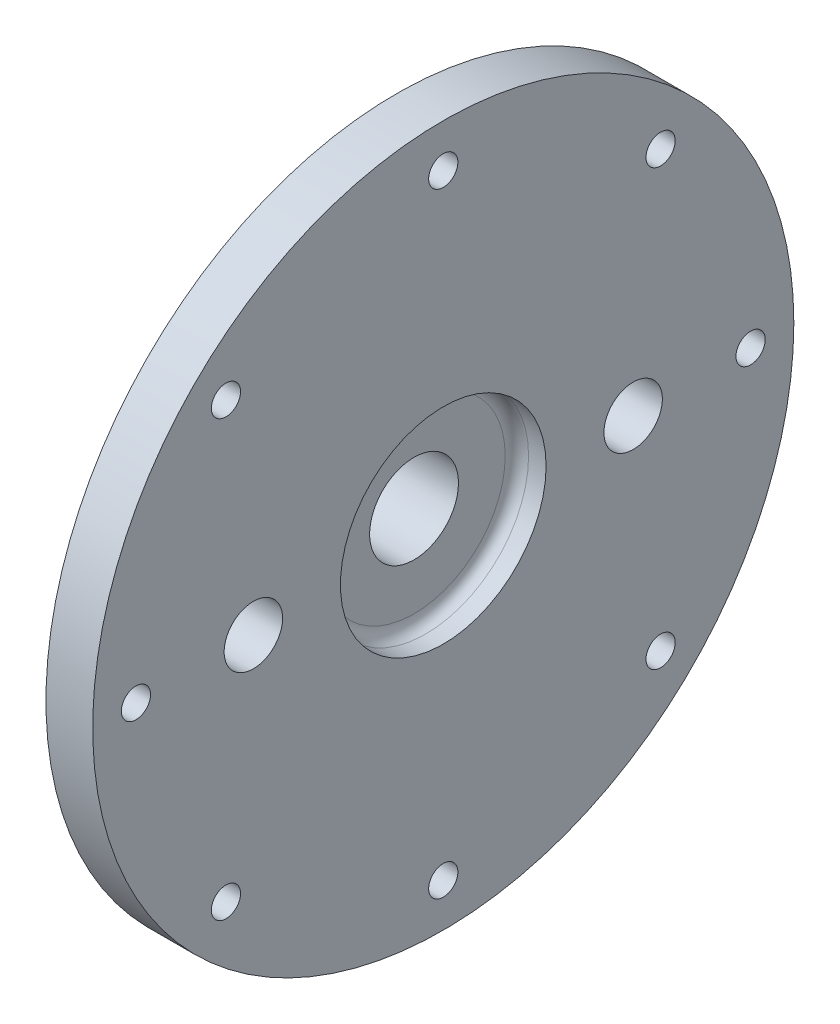
ISO-10303-21;
HEADER;
FILE_DESCRIPTION(('STEP AP214'),'2;1');
FILE_NAME('part.step','',(''),(''),'','','');
FILE_SCHEMA(('AUTOMOTIVE_DESIGN { 1 0 10303 214 1 1 1 1 }'));
ENDSEC;
DATA;
#1=APPLICATION_CONTEXT('core data for automotive mechanical design processes');
#2=APPLICATION_PROTOCOL_DEFINITION('international standard','automotive_design',2000,#1);
#3=PRODUCT_CONTEXT('',#1,'mechanical');
#4=PRODUCT('Part','Part','',(#3));
#5=PRODUCT_RELATED_PRODUCT_CATEGORY('part','',(#4));
#6=PRODUCT_DEFINITION_FORMATION('','',#4);
#7=PRODUCT_DEFINITION_CONTEXT('part definition',#1,'design');
#8=PRODUCT_DEFINITION('design','',#6,#7);
#9=PRODUCT_DEFINITION_SHAPE('','',#8);
#10=(LENGTH_UNIT() NAMED_UNIT(*) SI_UNIT(.MILLI.,.METRE.));
#11=(NAMED_UNIT(*) PLANE_ANGLE_UNIT() SI_UNIT($,.RADIAN.));
#12=(NAMED_UNIT(*) SI_UNIT($,.STERADIAN.) SOLID_ANGLE_UNIT());
#13=UNCERTAINTY_MEASURE_WITH_UNIT(LENGTH_MEASURE(1.E-05),#10,'distance_accuracy_value','');
#14=(GEOMETRIC_REPRESENTATION_CONTEXT(3) GLOBAL_UNCERTAINTY_ASSIGNED_CONTEXT((#13)) GLOBAL_UNIT_ASSIGNED_CONTEXT((#10,
#11,#12)) REPRESENTATION_CONTEXT('',''));
#15=CARTESIAN_POINT('',(0.,0.,0.));
#16=DIRECTION('',(0.,0.,1.));
#17=DIRECTION('',(1.,0.,0.));
#18=AXIS2_PLACEMENT_3D('',#15,#16,#17);
#19=CARTESIAN_POINT('',(0.,22.352,0.));
#20=DIRECTION('',(1.,0.,0.));
#21=DIRECTION('',(0.,0.,-1.));
#22=AXIS2_PLACEMENT_3D('',#19,#20,#21);
#23=PLANE('',#22);
#24=CARTESIAN_POINT('',(0.,66.802,2.33237936397399E-13));
#25=DIRECTION('',(1.,0.,0.));
#26=DIRECTION('',(0.,1.,0.));
#27=AXIS2_PLACEMENT_3D('',#24,#25,#26);
#28=CIRCLE('',#27,3.175);
#29=CARTESIAN_POINT('',(0.,69.977,2.44323389648226E-13));
#30=VERTEX_POINT('',#29);
#31=EDGE_CURVE('E165',#30,#30,#28,.T.);
#32=ORIENTED_EDGE('',*,*,#31,.F.);
#33=EDGE_LOOP('',(#32));
#34=FACE_BOUND('',#33,.T.);
#35=CARTESIAN_POINT('',(0.,47.2361471968235,47.236147196824));
#36=DIRECTION('',(1.,0.,0.));
#37=DIRECTION('',(0.,0.707106781186544,0.707106781186551));
#38=AXIS2_PLACEMENT_3D('',#35,#36,#37);
#39=CIRCLE('',#38,3.175);
#40=CARTESIAN_POINT('',(0.,49.4812112270908,49.4812112270913));
#41=VERTEX_POINT('',#40);
#42=EDGE_CURVE('E169',#41,#41,#39,.T.);
#43=ORIENTED_EDGE('',*,*,#42,.F.);
#44=EDGE_LOOP('',(#43));
#45=FACE_BOUND('',#44,.T.);
#46=CARTESIAN_POINT('',(0.,0.,66.802));
#47=DIRECTION('',(1.,0.,0.));
#48=DIRECTION('',(0.,0.,1.));
#49=AXIS2_PLACEMENT_3D('',#46,#47,#48);
#50=CIRCLE('',#49,3.175);
#51=CARTESIAN_POINT('',(0.,0.,69.977));
#52=VERTEX_POINT('',#51);
#53=EDGE_CURVE('E173',#52,#52,#50,.T.);
#54=ORIENTED_EDGE('',*,*,#53,.F.);
#55=EDGE_LOOP('',(#54));
#56=FACE_BOUND('',#55,.T.);
#57=CARTESIAN_POINT('',(0.,-47.2361471968242,47.2361471968233));
#58=DIRECTION('',(1.,0.,0.));
#59=DIRECTION('',(0.,-0.707106781186554,0.707106781186541));
#60=AXIS2_PLACEMENT_3D('',#57,#58,#59);
#61=CIRCLE('',#60,3.175);
#62=CARTESIAN_POINT('',(0.,-49.4812112270915,49.4812112270906));
#63=VERTEX_POINT('',#62);
#64=EDGE_CURVE('E177',#63,#63,#61,.T.);
#65=ORIENTED_EDGE('',*,*,#64,.F.);
#66=EDGE_LOOP('',(#65));
#67=FACE_BOUND('',#66,.T.);
#68=CARTESIAN_POINT('',(0.,-66.802,-6.99713809192197E-13));
#69=DIRECTION('',(1.,0.,0.));
#70=DIRECTION('',(0.,-1.,0.));
#71=AXIS2_PLACEMENT_3D('',#68,#69,#70);
#72=CIRCLE('',#71,3.175);
#73=CARTESIAN_POINT('',(0.,-69.977,-7.32970168944678E-13));
#74=VERTEX_POINT('',#73);
#75=EDGE_CURVE('E181',#74,#74,#72,.T.);
#76=ORIENTED_EDGE('',*,*,#75,.F.);
#77=EDGE_LOOP('',(#76));
#78=FACE_BOUND('',#77,.T.);
#79=CARTESIAN_POINT('',(0.,-47.2361471968232,-47.2361471968243));
#80=DIRECTION('',(1.,0.,0.));
#81=DIRECTION('',(0.,-0.707106781186539,-0.707106781186556));
#82=AXIS2_PLACEMENT_3D('',#79,#80,#81);
#83=CIRCLE('',#82,3.175);
#84=CARTESIAN_POINT('',(0.,-49.4812112270904,-49.4812112270916));
#85=VERTEX_POINT('',#84);
#86=EDGE_CURVE('E185',#85,#85,#83,.T.);
#87=ORIENTED_EDGE('',*,*,#86,.F.);
#88=EDGE_LOOP('',(#87));
#89=FACE_BOUND('',#88,.T.);
#90=CARTESIAN_POINT('',(0.,47.2361471968238,-47.2361471968237));
#91=DIRECTION('',(1.,0.,0.));
#92=DIRECTION('',(0.,0.707106781186549,-0.707106781186546));
#93=AXIS2_PLACEMENT_3D('',#90,#91,#92);
#94=CIRCLE('',#93,3.175);
#95=CARTESIAN_POINT('',(0.,49.4812112270911,-49.481211227091));
#96=VERTEX_POINT('',#95);
#97=EDGE_CURVE('E75',#96,#96,#94,.T.);
#98=ORIENTED_EDGE('',*,*,#97,.F.);
#99=EDGE_LOOP('',(#98));
#100=FACE_BOUND('',#99,.T.);
#101=CARTESIAN_POINT('',(0.,0.,-66.802));
#102=DIRECTION('',(1.,0.,0.));
#103=DIRECTION('',(0.,0.,-1.));
#104=AXIS2_PLACEMENT_3D('',#101,#102,#103);
#105=CIRCLE('',#104,3.175);
#106=CARTESIAN_POINT('',(0.,0.,-69.977));
#107=VERTEX_POINT('',#106);
#108=EDGE_CURVE('E69',#107,#107,#105,.T.);
#109=ORIENTED_EDGE('',*,*,#108,.F.);
#110=EDGE_LOOP('',(#109));
#111=FACE_BOUND('',#110,.T.);
#112=CARTESIAN_POINT('',(0.,0.,-41.275));
#113=DIRECTION('',(1.,0.,0.));
#114=DIRECTION('',(0.,0.,-1.));
#115=AXIS2_PLACEMENT_3D('',#112,#113,#114);
#116=CIRCLE('',#115,6.35);
#117=CARTESIAN_POINT('',(0.,0.,-47.625));
#118=VERTEX_POINT('',#117);
#119=EDGE_CURVE('E65',#118,#118,#116,.T.);
#120=ORIENTED_EDGE('',*,*,#119,.F.);
#121=EDGE_LOOP('',(#120));
#122=FACE_BOUND('',#121,.T.);
#123=CARTESIAN_POINT('',(0.,0.,41.275));
#124=DIRECTION('',(1.,0.,0.));
#125=DIRECTION('',(0.,0.,-1.));
#126=AXIS2_PLACEMENT_3D('',#123,#124,#125);
#127=CIRCLE('',#126,6.35);
#128=CARTESIAN_POINT('',(0.,0.,34.925));
#129=VERTEX_POINT('',#128);
#130=EDGE_CURVE('E59',#129,#129,#127,.T.);
#131=ORIENTED_EDGE('',*,*,#130,.F.);
#132=EDGE_LOOP('',(#131));
#133=FACE_BOUND('',#132,.T.);
#134=CARTESIAN_POINT('',(0.,0.,0.));
#135=DIRECTION('',(1.,0.,0.));
#136=DIRECTION('',(0.,0.,-1.));
#137=AXIS2_PLACEMENT_3D('',#134,#135,#136);
#138=CIRCLE('',#137,76.2);
#139=CARTESIAN_POINT('',(0.,0.,-76.2));
#140=VERTEX_POINT('',#139);
#141=EDGE_CURVE('E113',#140,#140,#138,.T.);
#142=ORIENTED_EDGE('',*,*,#141,.T.);
#143=EDGE_LOOP('',(#142));
#144=FACE_BOUND('',#143,.T.);
#145=CARTESIAN_POINT('',(0.,0.,0.));
#146=DIRECTION('',(1.,0.,0.));
#147=DIRECTION('',(0.,0.,-1.));
#148=AXIS2_PLACEMENT_3D('',#145,#146,#147);
#149=CIRCLE('',#148,22.352);
#150=CARTESIAN_POINT('',(0.,0.,-22.352));
#151=VERTEX_POINT('',#150);
#152=EDGE_CURVE('E10',#151,#151,#149,.T.);
#153=ORIENTED_EDGE('',*,*,#152,.F.);
#154=EDGE_LOOP('',(#153));
#155=FACE_BOUND('',#154,.T.);
#156=ADVANCED_FACE('F37',(#34,#45,#56,#67,#78,#89,#100,#111,#122,#133,#144,#155),#23,.T.);
#157=CARTESIAN_POINT('',(0.,0.,0.));
#158=DIRECTION('',(1.,0.,0.));
#159=DIRECTION('',(0.,0.,-1.));
#160=AXIS2_PLACEMENT_3D('',#157,#158,#159);
#161=CYLINDRICAL_SURFACE('',#160,22.352);
#162=ORIENTED_EDGE('',*,*,#152,.T.);
#163=EDGE_LOOP('',(#162));
#164=FACE_BOUND('',#163,.T.);
#165=CARTESIAN_POINT('',(-3.81,0.,0.));
#166=DIRECTION('',(1.,0.,0.));
#167=DIRECTION('',(0.,0.,-1.));
#168=AXIS2_PLACEMENT_3D('',#165,#166,#167);
#169=CIRCLE('',#168,22.352);
#170=CARTESIAN_POINT('',(-3.81,0.,-22.352));
#171=VERTEX_POINT('',#170);
#172=EDGE_CURVE('E45',#171,#171,#169,.T.);
#173=ORIENTED_EDGE('',*,*,#172,.F.);
#174=EDGE_LOOP('',(#173));
#175=FACE_BOUND('',#174,.T.);
#176=ADVANCED_FACE('F149',(#164,#175),#161,.F.);
#177=CARTESIAN_POINT('',(-3.81,0.,0.));
#178=DIRECTION('',(1.,0.,0.));
#179=DIRECTION('',(0.,0.,-1.));
#180=AXIS2_PLACEMENT_3D('',#177,#178,#179);
#181=TOROIDAL_SURFACE('',#180,19.812,2.54);
#182=ORIENTED_EDGE('',*,*,#172,.T.);
#183=EDGE_LOOP('',(#182));
#184=FACE_BOUND('',#183,.T.);
#185=CARTESIAN_POINT('',(-6.35,0.,0.));
#186=DIRECTION('',(1.,0.,0.));
#187=DIRECTION('',(0.,0.,-1.));
#188=AXIS2_PLACEMENT_3D('',#185,#186,#187);
#189=CIRCLE('',#188,19.812);
#190=CARTESIAN_POINT('',(-6.35,0.,-19.812));
#191=VERTEX_POINT('',#190);
#192=EDGE_CURVE('E51',#191,#191,#189,.T.);
#193=ORIENTED_EDGE('',*,*,#192,.F.);
#194=EDGE_LOOP('',(#193));
#195=FACE_BOUND('',#194,.T.);
#196=ADVANCED_FACE('F147',(#184,#195),#181,.F.);
#197=CARTESIAN_POINT('',(-6.35,9.652,0.));
#198=DIRECTION('',(1.,0.,0.));
#199=DIRECTION('',(0.,0.,-1.));
#200=AXIS2_PLACEMENT_3D('',#197,#198,#199);
#201=PLANE('',#200);
#202=ORIENTED_EDGE('',*,*,#192,.T.);
#203=EDGE_LOOP('',(#202));
#204=FACE_BOUND('',#203,.T.);
#205=CARTESIAN_POINT('',(-6.35,0.,0.));
#206=DIRECTION('',(1.,0.,0.));
#207=DIRECTION('',(0.,0.,-1.));
#208=AXIS2_PLACEMENT_3D('',#205,#206,#207);
#209=CIRCLE('',#208,9.652);
#210=CARTESIAN_POINT('',(-6.35,0.,-9.652));
#211=VERTEX_POINT('',#210);
#212=EDGE_CURVE('E137',#211,#211,#209,.T.);
#213=ORIENTED_EDGE('',*,*,#212,.F.);
#214=EDGE_LOOP('',(#213));
#215=FACE_BOUND('',#214,.T.);
#216=ADVANCED_FACE('F144',(#204,#215),#201,.T.);
#217=CARTESIAN_POINT('',(0.,0.,0.));
#218=DIRECTION('',(1.,0.,0.));
#219=DIRECTION('',(0.,0.,-1.));
#220=AXIS2_PLACEMENT_3D('',#217,#218,#219);
#221=CYLINDRICAL_SURFACE('',#220,9.652);
#222=ORIENTED_EDGE('',*,*,#212,.T.);
#223=EDGE_LOOP('',(#222));
#224=FACE_BOUND('',#223,.T.);
#225=CARTESIAN_POINT('',(-31.75,0.,0.));
#226=DIRECTION('',(1.,0.,0.));
#227=DIRECTION('',(0.,0.,-1.));
#228=AXIS2_PLACEMENT_3D('',#225,#226,#227);
#229=CIRCLE('',#228,9.652);
#230=CARTESIAN_POINT('',(-31.75,0.,-9.652));
#231=VERTEX_POINT('',#230);
#232=EDGE_CURVE('E133',#231,#231,#229,.T.);
#233=ORIENTED_EDGE('',*,*,#232,.F.);
#234=EDGE_LOOP('',(#233));
#235=FACE_BOUND('',#234,.T.);
#236=ADVANCED_FACE('F156',(#224,#235),#221,.F.);
#237=CARTESIAN_POINT('',(-31.75,16.002,0.));
#238=DIRECTION('',(-1.,0.,0.));
#239=DIRECTION('',(0.,0.,1.));
#240=AXIS2_PLACEMENT_3D('',#237,#238,#239);
#241=PLANE('',#240);
#242=ORIENTED_EDGE('',*,*,#232,.T.);
#243=EDGE_LOOP('',(#242));
#244=FACE_BOUND('',#243,.T.);
#245=CARTESIAN_POINT('',(-31.75,0.,0.));
#246=DIRECTION('',(1.,0.,0.));
#247=DIRECTION('',(0.,0.,-1.));
#248=AXIS2_PLACEMENT_3D('',#245,#246,#247);
#249=CIRCLE('',#248,16.002);
#250=CARTESIAN_POINT('',(-31.75,0.,-16.002));
#251=VERTEX_POINT('',#250);
#252=EDGE_CURVE('E129',#251,#251,#249,.T.);
#253=ORIENTED_EDGE('',*,*,#252,.F.);
#254=EDGE_LOOP('',(#253));
#255=FACE_BOUND('',#254,.T.);
#256=ADVANCED_FACE('F221',(#244,#255),#241,.T.);
#257=CARTESIAN_POINT('',(0.,0.,0.));
#258=DIRECTION('',(1.,0.,0.));
#259=DIRECTION('',(0.,0.,-1.));
#260=AXIS2_PLACEMENT_3D('',#257,#258,#259);
#261=CYLINDRICAL_SURFACE('',#260,16.002);
#262=ORIENTED_EDGE('',*,*,#252,.T.);
#263=EDGE_LOOP('',(#262));
#264=FACE_BOUND('',#263,.T.);
#265=CARTESIAN_POINT('',(-15.24,0.,0.));
#266=DIRECTION('',(1.,0.,0.));
#267=DIRECTION('',(0.,0.,-1.));
#268=AXIS2_PLACEMENT_3D('',#265,#266,#267);
#269=CIRCLE('',#268,16.002);
#270=CARTESIAN_POINT('',(-15.24,0.,-16.002));
#271=VERTEX_POINT('',#270);
#272=EDGE_CURVE('E125',#271,#271,#269,.T.);
#273=ORIENTED_EDGE('',*,*,#272,.F.);
#274=EDGE_LOOP('',(#273));
#275=FACE_BOUND('',#274,.T.);
#276=ADVANCED_FACE('F217',(#264,#275),#261,.T.);
#277=CARTESIAN_POINT('',(-15.24,0.,0.));
#278=DIRECTION('',(1.,0.,0.));
#279=DIRECTION('',(0.,0.,-1.));
#280=AXIS2_PLACEMENT_3D('',#277,#278,#279);
#281=TOROIDAL_SURFACE('',#280,21.082,5.08);
#282=ORIENTED_EDGE('',*,*,#272,.T.);
#283=EDGE_LOOP('',(#282));
#284=FACE_BOUND('',#283,.T.);
#285=CARTESIAN_POINT('',(-10.16,0.,0.));
#286=DIRECTION('',(1.,0.,0.));
#287=DIRECTION('',(0.,0.,-1.));
#288=AXIS2_PLACEMENT_3D('',#285,#286,#287);
#289=CIRCLE('',#288,21.082);
#290=CARTESIAN_POINT('',(-10.16,0.,-21.082));
#291=VERTEX_POINT('',#290);
#292=EDGE_CURVE('E121',#291,#291,#289,.T.);
#293=ORIENTED_EDGE('',*,*,#292,.F.);
#294=EDGE_LOOP('',(#293));
#295=FACE_BOUND('',#294,.T.);
#296=ADVANCED_FACE('F210',(#284,#295),#281,.F.);
#297=CARTESIAN_POINT('',(-10.16,76.2,0.));
#298=DIRECTION('',(-1.,0.,0.));
#299=DIRECTION('',(0.,0.,1.));
#300=AXIS2_PLACEMENT_3D('',#297,#298,#299);
#301=PLANE('',#300);
#302=CARTESIAN_POINT('',(-10.16,66.802,2.33237936397399E-13));
#303=DIRECTION('',(-1.,0.,0.));
#304=DIRECTION('',(0.,0.,1.));
#305=AXIS2_PLACEMENT_3D('',#302,#303,#304);
#306=CIRCLE('',#305,3.175);
#307=CARTESIAN_POINT('',(-10.16,66.802,3.17500000000023));
#308=VERTEX_POINT('',#307);
#309=EDGE_CURVE('E40',#308,#308,#306,.T.);
#310=ORIENTED_EDGE('',*,*,#309,.F.);
#311=EDGE_LOOP('',(#310));
#312=FACE_BOUND('',#311,.T.);
#313=CARTESIAN_POINT('',(-10.16,47.2361471968235,47.236147196824));
#314=DIRECTION('',(-1.,0.,0.));
#315=DIRECTION('',(0.,0.,1.));
#316=AXIS2_PLACEMENT_3D('',#313,#314,#315);
#317=CIRCLE('',#316,3.175);
#318=CARTESIAN_POINT('',(-10.16,47.2361471968235,50.411147196824));
#319=VERTEX_POINT('',#318);
#320=EDGE_CURVE('E90',#319,#319,#317,.T.);
#321=ORIENTED_EDGE('',*,*,#320,.F.);
#322=EDGE_LOOP('',(#321));
#323=FACE_BOUND('',#322,.T.);
#324=CARTESIAN_POINT('',(-10.16,0.,66.802));
#325=DIRECTION('',(-1.,0.,0.));
#326=DIRECTION('',(0.,0.,1.));
#327=AXIS2_PLACEMENT_3D('',#324,#325,#326);
#328=CIRCLE('',#327,3.175);
#329=CARTESIAN_POINT('',(-10.16,0.,69.977));
#330=VERTEX_POINT('',#329);
#331=EDGE_CURVE('E87',#330,#330,#328,.T.);
#332=ORIENTED_EDGE('',*,*,#331,.F.);
#333=EDGE_LOOP('',(#332));
#334=FACE_BOUND('',#333,.T.);
#335=CARTESIAN_POINT('',(-10.16,-47.2361471968242,47.2361471968233));
#336=DIRECTION('',(-1.,0.,0.));
#337=DIRECTION('',(0.,0.,1.));
#338=AXIS2_PLACEMENT_3D('',#335,#336,#337);
#339=CIRCLE('',#338,3.175);
#340=CARTESIAN_POINT('',(-10.16,-47.2361471968242,50.4111471968233));
#341=VERTEX_POINT('',#340);
#342=EDGE_CURVE('E83',#341,#341,#339,.T.);
#343=ORIENTED_EDGE('',*,*,#342,.F.);
#344=EDGE_LOOP('',(#343));
#345=FACE_BOUND('',#344,.T.);
#346=CARTESIAN_POINT('',(-10.16,-66.802,-6.99713809192197E-13));
#347=DIRECTION('',(-1.,0.,0.));
#348=DIRECTION('',(0.,0.,1.));
#349=AXIS2_PLACEMENT_3D('',#346,#347,#348);
#350=CIRCLE('',#349,3.175);
#351=CARTESIAN_POINT('',(-10.16,-66.802,3.1749999999993));
#352=VERTEX_POINT('',#351);
#353=EDGE_CURVE('E79',#352,#352,#350,.T.);
#354=ORIENTED_EDGE('',*,*,#353,.F.);
#355=EDGE_LOOP('',(#354));
#356=FACE_BOUND('',#355,.T.);
#357=CARTESIAN_POINT('',(-10.16,-47.2361471968232,-47.2361471968243));
#358=DIRECTION('',(-1.,0.,0.));
#359=DIRECTION('',(0.,0.,1.));
#360=AXIS2_PLACEMENT_3D('',#357,#358,#359);
#361=CIRCLE('',#360,3.175);
#362=CARTESIAN_POINT('',(-10.16,-47.2361471968232,-44.0611471968243));
#363=VERTEX_POINT('',#362);
#364=EDGE_CURVE('E74',#363,#363,#361,.T.);
#365=ORIENTED_EDGE('',*,*,#364,.F.);
#366=EDGE_LOOP('',(#365));
#367=FACE_BOUND('',#366,.T.);
#368=CARTESIAN_POINT('',(-10.16,47.2361471968238,-47.2361471968237));
#369=DIRECTION('',(-1.,0.,0.));
#370=DIRECTION('',(0.,0.,1.));
#371=AXIS2_PLACEMENT_3D('',#368,#369,#370);
#372=CIRCLE('',#371,3.175);
#373=CARTESIAN_POINT('',(-10.16,47.2361471968238,-44.0611471968237));
#374=VERTEX_POINT('',#373);
#375=EDGE_CURVE('E70',#374,#374,#372,.T.);
#376=ORIENTED_EDGE('',*,*,#375,.F.);
#377=EDGE_LOOP('',(#376));
#378=FACE_BOUND('',#377,.T.);
#379=CARTESIAN_POINT('',(-10.16,0.,-66.802));
#380=DIRECTION('',(-1.,0.,0.));
#381=DIRECTION('',(0.,0.,1.));
#382=AXIS2_PLACEMENT_3D('',#379,#380,#381);
#383=CIRCLE('',#382,3.175);
#384=CARTESIAN_POINT('',(-10.16,0.,-63.627));
#385=VERTEX_POINT('',#384);
#386=EDGE_CURVE('E60',#385,#385,#383,.T.);
#387=ORIENTED_EDGE('',*,*,#386,.F.);
#388=EDGE_LOOP('',(#387));
#389=FACE_BOUND('',#388,.T.);
#390=CARTESIAN_POINT('',(-10.16,0.,-41.275));
#391=DIRECTION('',(-1.,0.,0.));
#392=DIRECTION('',(0.,0.,1.));
#393=AXIS2_PLACEMENT_3D('',#390,#391,#392);
#394=CIRCLE('',#393,6.35);
#395=CARTESIAN_POINT('',(-10.16,0.,-34.925));
#396=VERTEX_POINT('',#395);
#397=EDGE_CURVE('E61',#396,#396,#394,.T.);
#398=ORIENTED_EDGE('',*,*,#397,.F.);
#399=EDGE_LOOP('',(#398));
#400=FACE_BOUND('',#399,.T.);
#401=CARTESIAN_POINT('',(-10.16,0.,41.275));
#402=DIRECTION('',(-1.,0.,0.));
#403=DIRECTION('',(0.,0.,1.));
#404=AXIS2_PLACEMENT_3D('',#401,#402,#403);
#405=CIRCLE('',#404,6.35);
#406=CARTESIAN_POINT('',(-10.16,0.,47.625));
#407=VERTEX_POINT('',#406);
#408=EDGE_CURVE('E55',#407,#407,#405,.T.);
#409=ORIENTED_EDGE('',*,*,#408,.F.);
#410=EDGE_LOOP('',(#409));
#411=FACE_BOUND('',#410,.T.);
#412=ORIENTED_EDGE('',*,*,#292,.T.);
#413=EDGE_LOOP('',(#412));
#414=FACE_BOUND('',#413,.T.);
#415=CARTESIAN_POINT('',(-10.16,0.,0.));
#416=DIRECTION('',(1.,0.,0.));
#417=DIRECTION('',(0.,0.,-1.));
#418=AXIS2_PLACEMENT_3D('',#415,#416,#417);
#419=CIRCLE('',#418,76.2);
#420=CARTESIAN_POINT('',(-10.16,0.,-76.2));
#421=VERTEX_POINT('',#420);
#422=EDGE_CURVE('E117',#421,#421,#419,.T.);
#423=ORIENTED_EDGE('',*,*,#422,.F.);
#424=EDGE_LOOP('',(#423));
#425=FACE_BOUND('',#424,.T.);
#426=ADVANCED_FACE('F200',(#312,#323,#334,#345,#356,#367,#378,#389,#400,#411,#414,#425),#301,.T.);
#427=CARTESIAN_POINT('',(0.,0.,0.));
#428=DIRECTION('',(1.,0.,0.));
#429=DIRECTION('',(0.,0.,-1.));
#430=AXIS2_PLACEMENT_3D('',#427,#428,#429);
#431=CYLINDRICAL_SURFACE('',#430,76.2);
#432=ORIENTED_EDGE('',*,*,#422,.T.);
#433=EDGE_LOOP('',(#432));
#434=FACE_BOUND('',#433,.T.);
#435=ORIENTED_EDGE('',*,*,#141,.F.);
#436=EDGE_LOOP('',(#435));
#437=FACE_BOUND('',#436,.T.);
#438=ADVANCED_FACE('F197',(#434,#437),#431,.T.);
#439=CARTESIAN_POINT('',(-31.75,0.,41.275));
#440=DIRECTION('',(1.,0.,0.));
#441=DIRECTION('',(0.,0.,-1.));
#442=AXIS2_PLACEMENT_3D('',#439,#440,#441);
#443=CYLINDRICAL_SURFACE('',#442,6.35);
#444=ORIENTED_EDGE('',*,*,#130,.T.);
#445=EDGE_LOOP('',(#444));
#446=FACE_BOUND('',#445,.T.);
#447=ORIENTED_EDGE('',*,*,#408,.T.);
#448=EDGE_LOOP('',(#447));
#449=FACE_BOUND('',#448,.T.);
#450=ADVANCED_FACE('F199',(#446,#449),#443,.F.);
#451=CARTESIAN_POINT('',(-31.75,0.,-41.275));
#452=DIRECTION('',(1.,0.,0.));
#453=DIRECTION('',(0.,0.,-1.));
#454=AXIS2_PLACEMENT_3D('',#451,#452,#453);
#455=CYLINDRICAL_SURFACE('',#454,6.35);
#456=ORIENTED_EDGE('',*,*,#119,.T.);
#457=EDGE_LOOP('',(#456));
#458=FACE_BOUND('',#457,.T.);
#459=ORIENTED_EDGE('',*,*,#397,.T.);
#460=EDGE_LOOP('',(#459));
#461=FACE_BOUND('',#460,.T.);
#462=ADVANCED_FACE('F207',(#458,#461),#455,.F.);
#463=CARTESIAN_POINT('',(-31.75,0.,-66.802));
#464=DIRECTION('',(1.,0.,0.));
#465=DIRECTION('',(0.,0.,-1.));
#466=AXIS2_PLACEMENT_3D('',#463,#464,#465);
#467=CYLINDRICAL_SURFACE('',#466,3.175);
#468=ORIENTED_EDGE('',*,*,#386,.T.);
#469=EDGE_LOOP('',(#468));
#470=FACE_BOUND('',#469,.T.);
#471=ORIENTED_EDGE('',*,*,#108,.T.);
#472=EDGE_LOOP('',(#471));
#473=FACE_BOUND('',#472,.T.);
#474=ADVANCED_FACE('F275',(#470,#473),#467,.F.);
#475=CARTESIAN_POINT('',(-31.75,47.2361471968238,-47.2361471968237));
#476=DIRECTION('',(1.,0.,0.));
#477=DIRECTION('',(0.,0.,-1.));
#478=AXIS2_PLACEMENT_3D('',#475,#476,#477);
#479=CYLINDRICAL_SURFACE('',#478,3.175);
#480=ORIENTED_EDGE('',*,*,#375,.T.);
#481=EDGE_LOOP('',(#480));
#482=FACE_BOUND('',#481,.T.);
#483=ORIENTED_EDGE('',*,*,#97,.T.);
#484=EDGE_LOOP('',(#483));
#485=FACE_BOUND('',#484,.T.);
#486=ADVANCED_FACE('F269',(#482,#485),#479,.F.);
#487=CARTESIAN_POINT('',(-31.75,-47.2361471968232,-47.2361471968243));
#488=DIRECTION('',(1.,0.,0.));
#489=DIRECTION('',(0.,0.,-1.));
#490=AXIS2_PLACEMENT_3D('',#487,#488,#489);
#491=CYLINDRICAL_SURFACE('',#490,3.175);
#492=ORIENTED_EDGE('',*,*,#364,.T.);
#493=EDGE_LOOP('',(#492));
#494=FACE_BOUND('',#493,.T.);
#495=ORIENTED_EDGE('',*,*,#86,.T.);
#496=EDGE_LOOP('',(#495));
#497=FACE_BOUND('',#496,.T.);
#498=ADVANCED_FACE('F274',(#494,#497),#491,.F.);
#499=CARTESIAN_POINT('',(-31.75,-66.802,-6.99713809192197E-13));
#500=DIRECTION('',(1.,0.,0.));
#501=DIRECTION('',(0.,0.,-1.));
#502=AXIS2_PLACEMENT_3D('',#499,#500,#501);
#503=CYLINDRICAL_SURFACE('',#502,3.175);
#504=ORIENTED_EDGE('',*,*,#353,.T.);
#505=EDGE_LOOP('',(#504));
#506=FACE_BOUND('',#505,.T.);
#507=ORIENTED_EDGE('',*,*,#75,.T.);
#508=EDGE_LOOP('',(#507));
#509=FACE_BOUND('',#508,.T.);
#510=ADVANCED_FACE('F287',(#506,#509),#503,.F.);
#511=CARTESIAN_POINT('',(-31.75,-47.2361471968242,47.2361471968233));
#512=DIRECTION('',(1.,0.,0.));
#513=DIRECTION('',(0.,0.,-1.));
#514=AXIS2_PLACEMENT_3D('',#511,#512,#513);
#515=CYLINDRICAL_SURFACE('',#514,3.175);
#516=ORIENTED_EDGE('',*,*,#342,.T.);
#517=EDGE_LOOP('',(#516));
#518=FACE_BOUND('',#517,.T.);
#519=ORIENTED_EDGE('',*,*,#64,.T.);
#520=EDGE_LOOP('',(#519));
#521=FACE_BOUND('',#520,.T.);
#522=ADVANCED_FACE('F297',(#518,#521),#515,.F.);
#523=CARTESIAN_POINT('',(-31.75,0.,66.802));
#524=DIRECTION('',(1.,0.,0.));
#525=DIRECTION('',(0.,0.,-1.));
#526=AXIS2_PLACEMENT_3D('',#523,#524,#525);
#527=CYLINDRICAL_SURFACE('',#526,3.175);
#528=ORIENTED_EDGE('',*,*,#331,.T.);
#529=EDGE_LOOP('',(#528));
#530=FACE_BOUND('',#529,.T.);
#531=ORIENTED_EDGE('',*,*,#53,.T.);
#532=EDGE_LOOP('',(#531));
#533=FACE_BOUND('',#532,.T.);
#534=ADVANCED_FACE('F307',(#530,#533),#527,.F.);
#535=CARTESIAN_POINT('',(-31.75,47.2361471968235,47.236147196824));
#536=DIRECTION('',(1.,0.,0.));
#537=DIRECTION('',(0.,0.,-1.));
#538=AXIS2_PLACEMENT_3D('',#535,#536,#537);
#539=CYLINDRICAL_SURFACE('',#538,3.175);
#540=ORIENTED_EDGE('',*,*,#320,.T.);
#541=EDGE_LOOP('',(#540));
#542=FACE_BOUND('',#541,.T.);
#543=ORIENTED_EDGE('',*,*,#42,.T.);
#544=EDGE_LOOP('',(#543));
#545=FACE_BOUND('',#544,.T.);
#546=ADVANCED_FACE('F317',(#542,#545),#539,.F.);
#547=CARTESIAN_POINT('',(-31.75,66.802,2.33237936397399E-13));
#548=DIRECTION('',(1.,0.,0.));
#549=DIRECTION('',(0.,0.,-1.));
#550=AXIS2_PLACEMENT_3D('',#547,#548,#549);
#551=CYLINDRICAL_SURFACE('',#550,3.175);
#552=ORIENTED_EDGE('',*,*,#309,.T.);
#553=EDGE_LOOP('',(#552));
#554=FACE_BOUND('',#553,.T.);
#555=ORIENTED_EDGE('',*,*,#31,.T.);
#556=EDGE_LOOP('',(#555));
#557=FACE_BOUND('',#556,.T.);
#558=ADVANCED_FACE('F327',(#554,#557),#551,.F.);
#559=CLOSED_SHELL('',(#156,#176,#196,#216,#236,#256,#276,#296,#426,#438,#450,#462,#474,#486,
#498,#510,#522,#534,#546,#558));
#560=MANIFOLD_SOLID_BREP('B2',#559);
#561=ADVANCED_BREP_SHAPE_REPRESENTATION('',(#18,#560),#14);
#562=SHAPE_DEFINITION_REPRESENTATION(#9,#561);
ENDSEC;
END-ISO-10303-21;
